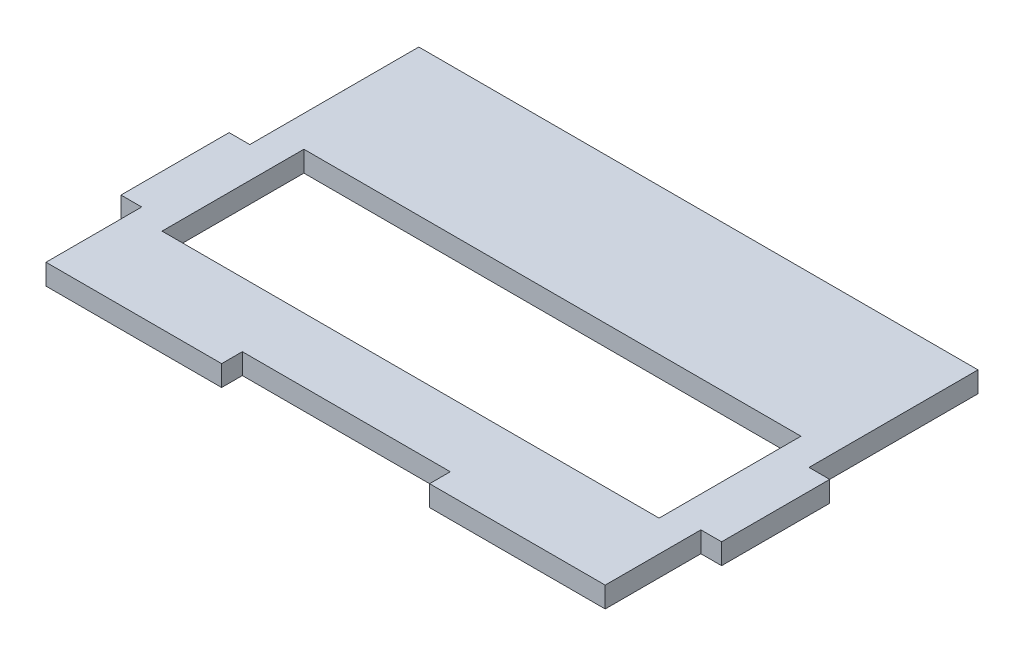
ISO-10303-21;
HEADER;
FILE_DESCRIPTION(('STEP AP214'),'2;1');
FILE_NAME('part.step','',(''),(''),'','','');
FILE_SCHEMA(('AUTOMOTIVE_DESIGN { 1 0 10303 214 1 1 1 1 }'));
ENDSEC;
DATA;
#1=APPLICATION_CONTEXT('core data for automotive mechanical design processes');
#2=APPLICATION_PROTOCOL_DEFINITION('international standard','automotive_design',2000,#1);
#3=PRODUCT_CONTEXT('',#1,'mechanical');
#4=PRODUCT('Part','Part','',(#3));
#5=PRODUCT_RELATED_PRODUCT_CATEGORY('part','',(#4));
#6=PRODUCT_DEFINITION_FORMATION('','',#4);
#7=PRODUCT_DEFINITION_CONTEXT('part definition',#1,'design');
#8=PRODUCT_DEFINITION('design','',#6,#7);
#9=PRODUCT_DEFINITION_SHAPE('','',#8);
#10=(LENGTH_UNIT() NAMED_UNIT(*) SI_UNIT(.MILLI.,.METRE.));
#11=(NAMED_UNIT(*) PLANE_ANGLE_UNIT() SI_UNIT($,.RADIAN.));
#12=(NAMED_UNIT(*) SI_UNIT($,.STERADIAN.) SOLID_ANGLE_UNIT());
#13=UNCERTAINTY_MEASURE_WITH_UNIT(LENGTH_MEASURE(1.E-05),#10,'distance_accuracy_value','');
#14=(GEOMETRIC_REPRESENTATION_CONTEXT(3) GLOBAL_UNCERTAINTY_ASSIGNED_CONTEXT((#13)) GLOBAL_UNIT_ASSIGNED_CONTEXT((#10,
#11,#12)) REPRESENTATION_CONTEXT('',''));
#15=CARTESIAN_POINT('',(0.,0.,0.));
#16=DIRECTION('',(0.,0.,1.));
#17=DIRECTION('',(1.,0.,0.));
#18=AXIS2_PLACEMENT_3D('',#15,#16,#17);
#19=CARTESIAN_POINT('',(-72.5,5.,45.));
#20=DIRECTION('',(0.,0.,-1.));
#21=DIRECTION('',(-1.,0.,0.));
#22=AXIS2_PLACEMENT_3D('',#19,#20,#21);
#23=PLANE('',#22);
#24=DIRECTION('',(0.,1.,0.));
#25=VECTOR('',#24,1.);
#26=CARTESIAN_POINT('',(25.1,0.,45.));
#27=LINE('',#26,#25);
#28=CARTESIAN_POINT('',(25.1,0.,45.));
#29=VERTEX_POINT('',#28);
#30=CARTESIAN_POINT('',(25.1,5.,45.));
#31=VERTEX_POINT('',#30);
#32=EDGE_CURVE('E210',#29,#31,#27,.T.);
#33=ORIENTED_EDGE('',*,*,#32,.F.);
#34=DIRECTION('',(1.,0.,0.));
#35=VECTOR('',#34,1.);
#36=CARTESIAN_POINT('',(-72.5,0.,45.));
#37=LINE('',#36,#35);
#38=CARTESIAN_POINT('',(67.5,0.,45.));
#39=VERTEX_POINT('',#38);
#40=EDGE_CURVE('E196',#29,#39,#37,.T.);
#41=ORIENTED_EDGE('',*,*,#40,.T.);
#42=DIRECTION('',(0.,1.,0.));
#43=VECTOR('',#42,1.);
#44=CARTESIAN_POINT('',(67.5,0.,45.));
#45=LINE('',#44,#43);
#46=CARTESIAN_POINT('',(67.5,5.,45.));
#47=VERTEX_POINT('',#46);
#48=EDGE_CURVE('E239',#39,#47,#45,.T.);
#49=ORIENTED_EDGE('',*,*,#48,.T.);
#50=DIRECTION('',(1.,0.,0.));
#51=VECTOR('',#50,1.);
#52=CARTESIAN_POINT('',(-72.5,5.,45.));
#53=LINE('',#52,#51);
#54=EDGE_CURVE('E48',#31,#47,#53,.T.);
#55=ORIENTED_EDGE('',*,*,#54,.F.);
#56=EDGE_LOOP('',(#33,#41,#49,#55));
#57=FACE_BOUND('',#56,.T.);
#58=ADVANCED_FACE('F39',(#57),#23,.F.);
#59=CARTESIAN_POINT('',(0.,5.,0.));
#60=DIRECTION('',(0.,-1.,0.));
#61=DIRECTION('',(0.,0.,-1.));
#62=AXIS2_PLACEMENT_3D('',#59,#60,#61);
#63=PLANE('',#62);
#64=DIRECTION('',(-1.,0.,0.));
#65=VECTOR('',#64,1.);
#66=CARTESIAN_POINT('',(-60.,5.,-9.76000000000001));
#67=LINE('',#66,#65);
#68=CARTESIAN_POINT('',(60.,5.,-9.76000000000001));
#69=VERTEX_POINT('',#68);
#70=CARTESIAN_POINT('',(-60.,5.,-9.76000000000001));
#71=VERTEX_POINT('',#70);
#72=EDGE_CURVE('E300',#69,#71,#67,.T.);
#73=ORIENTED_EDGE('',*,*,#72,.F.);
#74=DIRECTION('',(0.,0.,-1.));
#75=VECTOR('',#74,1.);
#76=CARTESIAN_POINT('',(60.,5.,24.49));
#77=LINE('',#76,#75);
#78=CARTESIAN_POINT('',(60.,5.,24.49));
#79=VERTEX_POINT('',#78);
#80=EDGE_CURVE('E278',#79,#69,#77,.T.);
#81=ORIENTED_EDGE('',*,*,#80,.F.);
#82=DIRECTION('',(1.,0.,0.));
#83=VECTOR('',#82,1.);
#84=CARTESIAN_POINT('',(-60.,5.,24.49));
#85=LINE('',#84,#83);
#86=CARTESIAN_POINT('',(-60.,5.,24.49));
#87=VERTEX_POINT('',#86);
#88=EDGE_CURVE('E290',#87,#79,#85,.T.);
#89=ORIENTED_EDGE('',*,*,#88,.F.);
#90=DIRECTION('',(0.,0.,1.));
#91=VECTOR('',#90,1.);
#92=CARTESIAN_POINT('',(-60.,5.,24.49));
#93=LINE('',#92,#91);
#94=EDGE_CURVE('E304',#71,#87,#93,.T.);
#95=ORIENTED_EDGE('',*,*,#94,.F.);
#96=EDGE_LOOP('',(#73,#81,#89,#95));
#97=FACE_BOUND('',#96,.T.);
#98=DIRECTION('',(0.,0.,-1.));
#99=VECTOR('',#98,1.);
#100=CARTESIAN_POINT('',(25.1,5.,40.));
#101=LINE('',#100,#99);
#102=CARTESIAN_POINT('',(25.1,5.,40.));
#103=VERTEX_POINT('',#102);
#104=EDGE_CURVE('E184',#31,#103,#101,.T.);
#105=ORIENTED_EDGE('',*,*,#104,.F.);
#106=ORIENTED_EDGE('',*,*,#54,.T.);
#107=DIRECTION('',(0.,0.,1.));
#108=VECTOR('',#107,1.);
#109=CARTESIAN_POINT('',(67.5,5.,45.));
#110=LINE('',#109,#108);
#111=CARTESIAN_POINT('',(67.5,5.,21.9));
#112=VERTEX_POINT('',#111);
#113=EDGE_CURVE('E242',#112,#47,#110,.T.);
#114=ORIENTED_EDGE('',*,*,#113,.F.);
#115=DIRECTION('',(-1.,0.,0.));
#116=VECTOR('',#115,1.);
#117=CARTESIAN_POINT('',(72.5,5.,21.9));
#118=LINE('',#117,#116);
#119=CARTESIAN_POINT('',(72.5,5.,21.9));
#120=VERTEX_POINT('',#119);
#121=EDGE_CURVE('E225',#120,#112,#118,.T.);
#122=ORIENTED_EDGE('',*,*,#121,.F.);
#123=DIRECTION('',(0.,0.,-1.));
#124=VECTOR('',#123,1.);
#125=CARTESIAN_POINT('',(72.5,5.,45.));
#126=LINE('',#125,#124);
#127=CARTESIAN_POINT('',(72.5,5.,-4.2));
#128=VERTEX_POINT('',#127);
#129=EDGE_CURVE('E316',#120,#128,#126,.T.);
#130=ORIENTED_EDGE('',*,*,#129,.T.);
#131=DIRECTION('',(1.,0.,0.));
#132=VECTOR('',#131,1.);
#133=CARTESIAN_POINT('',(72.5,5.,-4.2));
#134=LINE('',#133,#132);
#135=CARTESIAN_POINT('',(67.5,5.,-4.2));
#136=VERTEX_POINT('',#135);
#137=EDGE_CURVE('E256',#136,#128,#134,.T.);
#138=ORIENTED_EDGE('',*,*,#137,.F.);
#139=DIRECTION('',(0.,0.,1.));
#140=VECTOR('',#139,1.);
#141=CARTESIAN_POINT('',(67.5,5.,-45.));
#142=LINE('',#141,#140);
#143=CARTESIAN_POINT('',(67.5,5.,-45.));
#144=VERTEX_POINT('',#143);
#145=EDGE_CURVE('E244',#144,#136,#142,.T.);
#146=ORIENTED_EDGE('',*,*,#145,.F.);
#147=DIRECTION('',(-1.,0.,0.));
#148=VECTOR('',#147,1.);
#149=CARTESIAN_POINT('',(-72.5,5.,-45.));
#150=LINE('',#149,#148);
#151=CARTESIAN_POINT('',(-67.5,5.,-45.));
#152=VERTEX_POINT('',#151);
#153=EDGE_CURVE('E317',#144,#152,#150,.T.);
#154=ORIENTED_EDGE('',*,*,#153,.T.);
#155=DIRECTION('',(0.,0.,-1.));
#156=VECTOR('',#155,1.);
#157=CARTESIAN_POINT('',(-67.5,5.,-45.));
#158=LINE('',#157,#156);
#159=CARTESIAN_POINT('',(-67.5,5.,-4.2));
#160=VERTEX_POINT('',#159);
#161=EDGE_CURVE('E269',#160,#152,#158,.T.);
#162=ORIENTED_EDGE('',*,*,#161,.F.);
#163=DIRECTION('',(1.,0.,0.));
#164=VECTOR('',#163,1.);
#165=CARTESIAN_POINT('',(-72.5,5.,-4.2));
#166=LINE('',#165,#164);
#167=CARTESIAN_POINT('',(-72.5,5.,-4.2));
#168=VERTEX_POINT('',#167);
#169=EDGE_CURVE('E230',#168,#160,#166,.T.);
#170=ORIENTED_EDGE('',*,*,#169,.F.);
#171=DIRECTION('',(0.,0.,1.));
#172=VECTOR('',#171,1.);
#173=CARTESIAN_POINT('',(-72.5,5.,45.));
#174=LINE('',#173,#172);
#175=CARTESIAN_POINT('',(-72.5,5.,21.9));
#176=VERTEX_POINT('',#175);
#177=EDGE_CURVE('E325',#168,#176,#174,.T.);
#178=ORIENTED_EDGE('',*,*,#177,.T.);
#179=DIRECTION('',(-1.,0.,0.));
#180=VECTOR('',#179,1.);
#181=CARTESIAN_POINT('',(-72.5,5.,21.9));
#182=LINE('',#181,#180);
#183=CARTESIAN_POINT('',(-67.5,5.,21.9));
#184=VERTEX_POINT('',#183);
#185=EDGE_CURVE('E224',#184,#176,#182,.T.);
#186=ORIENTED_EDGE('',*,*,#185,.F.);
#187=DIRECTION('',(0.,0.,-1.));
#188=VECTOR('',#187,1.);
#189=CARTESIAN_POINT('',(-67.5,5.,45.));
#190=LINE('',#189,#188);
#191=CARTESIAN_POINT('',(-67.5,5.,45.));
#192=VERTEX_POINT('',#191);
#193=EDGE_CURVE('E223',#192,#184,#190,.T.);
#194=ORIENTED_EDGE('',*,*,#193,.F.);
#195=CARTESIAN_POINT('',(-25.1,5.,45.));
#196=VERTEX_POINT('',#195);
#197=EDGE_CURVE('E11',#192,#196,#53,.T.);
#198=ORIENTED_EDGE('',*,*,#197,.T.);
#199=DIRECTION('',(0.,0.,1.));
#200=VECTOR('',#199,1.);
#201=CARTESIAN_POINT('',(-25.1,5.,40.));
#202=LINE('',#201,#200);
#203=CARTESIAN_POINT('',(-25.1,5.,40.));
#204=VERTEX_POINT('',#203);
#205=EDGE_CURVE('E200',#204,#196,#202,.T.);
#206=ORIENTED_EDGE('',*,*,#205,.F.);
#207=DIRECTION('',(-1.,0.,0.));
#208=VECTOR('',#207,1.);
#209=CARTESIAN_POINT('',(-25.1,5.,40.));
#210=LINE('',#209,#208);
#211=EDGE_CURVE('E203',#103,#204,#210,.T.);
#212=ORIENTED_EDGE('',*,*,#211,.F.);
#213=EDGE_LOOP('',(#105,#106,#114,#122,#130,#138,#146,#154,#162,#170,#178,#186,#194,#198,#206,#212));
#214=FACE_BOUND('',#213,.T.);
#215=ADVANCED_FACE('F352',(#97,#214),#63,.F.);
#216=CARTESIAN_POINT('',(0.,0.,0.));
#217=DIRECTION('',(0.,-1.,0.));
#218=DIRECTION('',(0.,0.,-1.));
#219=AXIS2_PLACEMENT_3D('',#216,#217,#218);
#220=PLANE('',#219);
#221=DIRECTION('',(0.,0.,-1.));
#222=VECTOR('',#221,1.);
#223=CARTESIAN_POINT('',(60.,0.,24.49));
#224=LINE('',#223,#222);
#225=CARTESIAN_POINT('',(60.,0.,24.49));
#226=VERTEX_POINT('',#225);
#227=CARTESIAN_POINT('',(60.,0.,-9.76000000000001));
#228=VERTEX_POINT('',#227);
#229=EDGE_CURVE('E285',#226,#228,#224,.T.);
#230=ORIENTED_EDGE('',*,*,#229,.T.);
#231=DIRECTION('',(-1.,0.,0.));
#232=VECTOR('',#231,1.);
#233=CARTESIAN_POINT('',(-60.,0.,-9.76000000000001));
#234=LINE('',#233,#232);
#235=CARTESIAN_POINT('',(-60.,0.,-9.76000000000001));
#236=VERTEX_POINT('',#235);
#237=EDGE_CURVE('E289',#228,#236,#234,.T.);
#238=ORIENTED_EDGE('',*,*,#237,.T.);
#239=DIRECTION('',(0.,0.,1.));
#240=VECTOR('',#239,1.);
#241=CARTESIAN_POINT('',(-60.,0.,24.49));
#242=LINE('',#241,#240);
#243=CARTESIAN_POINT('',(-60.,0.,24.49));
#244=VERTEX_POINT('',#243);
#245=EDGE_CURVE('E292',#236,#244,#242,.T.);
#246=ORIENTED_EDGE('',*,*,#245,.T.);
#247=DIRECTION('',(1.,0.,0.));
#248=VECTOR('',#247,1.);
#249=CARTESIAN_POINT('',(-60.,0.,24.49));
#250=LINE('',#249,#248);
#251=EDGE_CURVE('E294',#244,#226,#250,.T.);
#252=ORIENTED_EDGE('',*,*,#251,.T.);
#253=EDGE_LOOP('',(#230,#238,#246,#252));
#254=FACE_BOUND('',#253,.T.);
#255=ORIENTED_EDGE('',*,*,#40,.F.);
#256=DIRECTION('',(0.,0.,-1.));
#257=VECTOR('',#256,1.);
#258=CARTESIAN_POINT('',(25.1,0.,40.));
#259=LINE('',#258,#257);
#260=CARTESIAN_POINT('',(25.1,0.,40.));
#261=VERTEX_POINT('',#260);
#262=EDGE_CURVE('E182',#29,#261,#259,.T.);
#263=ORIENTED_EDGE('',*,*,#262,.T.);
#264=DIRECTION('',(-1.,0.,0.));
#265=VECTOR('',#264,1.);
#266=CARTESIAN_POINT('',(-25.1,0.,40.));
#267=LINE('',#266,#265);
#268=CARTESIAN_POINT('',(-25.1,0.,40.));
#269=VERTEX_POINT('',#268);
#270=EDGE_CURVE('E192',#261,#269,#267,.T.);
#271=ORIENTED_EDGE('',*,*,#270,.T.);
#272=DIRECTION('',(0.,0.,1.));
#273=VECTOR('',#272,1.);
#274=CARTESIAN_POINT('',(-25.1,0.,40.));
#275=LINE('',#274,#273);
#276=CARTESIAN_POINT('',(-25.1,0.,45.));
#277=VERTEX_POINT('',#276);
#278=EDGE_CURVE('E57',#269,#277,#275,.T.);
#279=ORIENTED_EDGE('',*,*,#278,.T.);
#280=CARTESIAN_POINT('',(-67.5,0.,45.));
#281=VERTEX_POINT('',#280);
#282=EDGE_CURVE('E43',#281,#277,#37,.T.);
#283=ORIENTED_EDGE('',*,*,#282,.F.);
#284=DIRECTION('',(0.,0.,-1.));
#285=VECTOR('',#284,1.);
#286=CARTESIAN_POINT('',(-67.5,0.,45.));
#287=LINE('',#286,#285);
#288=CARTESIAN_POINT('',(-67.5,0.,21.9));
#289=VERTEX_POINT('',#288);
#290=EDGE_CURVE('E228',#281,#289,#287,.T.);
#291=ORIENTED_EDGE('',*,*,#290,.T.);
#292=DIRECTION('',(-1.,0.,0.));
#293=VECTOR('',#292,1.);
#294=CARTESIAN_POINT('',(-72.5,0.,21.9));
#295=LINE('',#294,#293);
#296=CARTESIAN_POINT('',(-72.5,0.,21.9));
#297=VERTEX_POINT('',#296);
#298=EDGE_CURVE('E216',#289,#297,#295,.T.);
#299=ORIENTED_EDGE('',*,*,#298,.T.);
#300=DIRECTION('',(0.,0.,1.));
#301=VECTOR('',#300,1.);
#302=CARTESIAN_POINT('',(-72.5,0.,45.));
#303=LINE('',#302,#301);
#304=CARTESIAN_POINT('',(-72.5,0.,-4.2));
#305=VERTEX_POINT('',#304);
#306=EDGE_CURVE('E328',#305,#297,#303,.T.);
#307=ORIENTED_EDGE('',*,*,#306,.F.);
#308=DIRECTION('',(1.,0.,0.));
#309=VECTOR('',#308,1.);
#310=CARTESIAN_POINT('',(-72.5,0.,-4.2));
#311=LINE('',#310,#309);
#312=CARTESIAN_POINT('',(-67.5,0.,-4.2));
#313=VERTEX_POINT('',#312);
#314=EDGE_CURVE('E266',#305,#313,#311,.T.);
#315=ORIENTED_EDGE('',*,*,#314,.T.);
#316=DIRECTION('',(0.,0.,-1.));
#317=VECTOR('',#316,1.);
#318=CARTESIAN_POINT('',(-67.5,0.,-45.));
#319=LINE('',#318,#317);
#320=CARTESIAN_POINT('',(-67.5,0.,-45.));
#321=VERTEX_POINT('',#320);
#322=EDGE_CURVE('E267',#313,#321,#319,.T.);
#323=ORIENTED_EDGE('',*,*,#322,.T.);
#324=DIRECTION('',(-1.,0.,0.));
#325=VECTOR('',#324,1.);
#326=CARTESIAN_POINT('',(-72.5,0.,-45.));
#327=LINE('',#326,#325);
#328=CARTESIAN_POINT('',(67.5,0.,-45.));
#329=VERTEX_POINT('',#328);
#330=EDGE_CURVE('E330',#329,#321,#327,.T.);
#331=ORIENTED_EDGE('',*,*,#330,.F.);
#332=DIRECTION('',(0.,0.,1.));
#333=VECTOR('',#332,1.);
#334=CARTESIAN_POINT('',(67.5,0.,-45.));
#335=LINE('',#334,#333);
#336=CARTESIAN_POINT('',(67.5,0.,-4.2));
#337=VERTEX_POINT('',#336);
#338=EDGE_CURVE('E257',#329,#337,#335,.T.);
#339=ORIENTED_EDGE('',*,*,#338,.T.);
#340=DIRECTION('',(1.,0.,0.));
#341=VECTOR('',#340,1.);
#342=CARTESIAN_POINT('',(72.5,0.,-4.2));
#343=LINE('',#342,#341);
#344=CARTESIAN_POINT('',(72.5,0.,-4.2));
#345=VERTEX_POINT('',#344);
#346=EDGE_CURVE('E65',#337,#345,#343,.T.);
#347=ORIENTED_EDGE('',*,*,#346,.T.);
#348=DIRECTION('',(0.,0.,-1.));
#349=VECTOR('',#348,1.);
#350=CARTESIAN_POINT('',(72.5,0.,45.));
#351=LINE('',#350,#349);
#352=CARTESIAN_POINT('',(72.5,0.,21.9));
#353=VERTEX_POINT('',#352);
#354=EDGE_CURVE('E310',#353,#345,#351,.T.);
#355=ORIENTED_EDGE('',*,*,#354,.F.);
#356=DIRECTION('',(-1.,0.,0.));
#357=VECTOR('',#356,1.);
#358=CARTESIAN_POINT('',(72.5,0.,21.9));
#359=LINE('',#358,#357);
#360=CARTESIAN_POINT('',(67.5,0.,21.9));
#361=VERTEX_POINT('',#360);
#362=EDGE_CURVE('E247',#353,#361,#359,.T.);
#363=ORIENTED_EDGE('',*,*,#362,.T.);
#364=DIRECTION('',(0.,0.,1.));
#365=VECTOR('',#364,1.);
#366=CARTESIAN_POINT('',(67.5,0.,45.));
#367=LINE('',#366,#365);
#368=EDGE_CURVE('E237',#361,#39,#367,.T.);
#369=ORIENTED_EDGE('',*,*,#368,.T.);
#370=EDGE_LOOP('',(#255,#263,#271,#279,#283,#291,#299,#307,#315,#323,#331,#339,#347,#355,#363,#369));
#371=FACE_BOUND('',#370,.T.);
#372=ADVANCED_FACE('F198',(#254,#371),#220,.T.);
#373=CARTESIAN_POINT('',(72.5,5.,45.));
#374=DIRECTION('',(-1.,0.,0.));
#375=DIRECTION('',(0.,0.,1.));
#376=AXIS2_PLACEMENT_3D('',#373,#374,#375);
#377=PLANE('',#376);
#378=ORIENTED_EDGE('',*,*,#354,.T.);
#379=DIRECTION('',(0.,1.,0.));
#380=VECTOR('',#379,1.);
#381=CARTESIAN_POINT('',(72.5,0.,-4.2));
#382=LINE('',#381,#380);
#383=EDGE_CURVE('E207',#345,#128,#382,.T.);
#384=ORIENTED_EDGE('',*,*,#383,.T.);
#385=ORIENTED_EDGE('',*,*,#129,.F.);
#386=DIRECTION('',(0.,1.,0.));
#387=VECTOR('',#386,1.);
#388=CARTESIAN_POINT('',(72.5,0.,21.9));
#389=LINE('',#388,#387);
#390=EDGE_CURVE('E231',#353,#120,#389,.T.);
#391=ORIENTED_EDGE('',*,*,#390,.F.);
#392=EDGE_LOOP('',(#378,#384,#385,#391));
#393=FACE_BOUND('',#392,.T.);
#394=ADVANCED_FACE('F41',(#393),#377,.F.);
#395=CARTESIAN_POINT('',(-72.5,5.,-45.));
#396=DIRECTION('',(0.,0.,1.));
#397=DIRECTION('',(1.,0.,0.));
#398=AXIS2_PLACEMENT_3D('',#395,#396,#397);
#399=PLANE('',#398);
#400=DIRECTION('',(0.,1.,0.));
#401=VECTOR('',#400,1.);
#402=CARTESIAN_POINT('',(67.5,0.,-45.));
#403=LINE('',#402,#401);
#404=EDGE_CURVE('E252',#329,#144,#403,.T.);
#405=ORIENTED_EDGE('',*,*,#404,.F.);
#406=ORIENTED_EDGE('',*,*,#330,.T.);
#407=DIRECTION('',(0.,1.,0.));
#408=VECTOR('',#407,1.);
#409=CARTESIAN_POINT('',(-67.5,0.,-45.));
#410=LINE('',#409,#408);
#411=EDGE_CURVE('E280',#321,#152,#410,.T.);
#412=ORIENTED_EDGE('',*,*,#411,.T.);
#413=ORIENTED_EDGE('',*,*,#153,.F.);
#414=EDGE_LOOP('',(#405,#406,#412,#413));
#415=FACE_BOUND('',#414,.T.);
#416=ADVANCED_FACE('F362',(#415),#399,.F.);
#417=CARTESIAN_POINT('',(-72.5,5.,45.));
#418=DIRECTION('',(1.,0.,0.));
#419=DIRECTION('',(0.,0.,-1.));
#420=AXIS2_PLACEMENT_3D('',#417,#418,#419);
#421=PLANE('',#420);
#422=ORIENTED_EDGE('',*,*,#306,.T.);
#423=DIRECTION('',(0.,1.,0.));
#424=VECTOR('',#423,1.);
#425=CARTESIAN_POINT('',(-72.5,0.,21.9));
#426=LINE('',#425,#424);
#427=EDGE_CURVE('E218',#297,#176,#426,.T.);
#428=ORIENTED_EDGE('',*,*,#427,.T.);
#429=ORIENTED_EDGE('',*,*,#177,.F.);
#430=DIRECTION('',(0.,1.,0.));
#431=VECTOR('',#430,1.);
#432=CARTESIAN_POINT('',(-72.5,0.,-4.2));
#433=LINE('',#432,#431);
#434=EDGE_CURVE('E272',#305,#168,#433,.T.);
#435=ORIENTED_EDGE('',*,*,#434,.F.);
#436=EDGE_LOOP('',(#422,#428,#429,#435));
#437=FACE_BOUND('',#436,.T.);
#438=ADVANCED_FACE('F348',(#437),#421,.F.);
#439=ORIENTED_EDGE('',*,*,#282,.T.);
#440=DIRECTION('',(0.,1.,0.));
#441=VECTOR('',#440,1.);
#442=CARTESIAN_POINT('',(-25.1,0.,45.));
#443=LINE('',#442,#441);
#444=EDGE_CURVE('E209',#277,#196,#443,.T.);
#445=ORIENTED_EDGE('',*,*,#444,.T.);
#446=ORIENTED_EDGE('',*,*,#197,.F.);
#447=DIRECTION('',(0.,1.,0.));
#448=VECTOR('',#447,1.);
#449=CARTESIAN_POINT('',(-67.5,0.,45.));
#450=LINE('',#449,#448);
#451=EDGE_CURVE('E212',#281,#192,#450,.T.);
#452=ORIENTED_EDGE('',*,*,#451,.F.);
#453=EDGE_LOOP('',(#439,#445,#446,#452));
#454=FACE_BOUND('',#453,.T.);
#455=ADVANCED_FACE('F336',(#454),#23,.F.);
#456=CARTESIAN_POINT('',(60.,0.,24.49));
#457=DIRECTION('',(1.,0.,0.));
#458=DIRECTION('',(0.,0.,-1.));
#459=AXIS2_PLACEMENT_3D('',#456,#457,#458);
#460=PLANE('',#459);
#461=ORIENTED_EDGE('',*,*,#80,.T.);
#462=DIRECTION('',(0.,1.,0.));
#463=VECTOR('',#462,1.);
#464=CARTESIAN_POINT('',(60.,0.,-9.76000000000001));
#465=LINE('',#464,#463);
#466=EDGE_CURVE('E299',#228,#69,#465,.T.);
#467=ORIENTED_EDGE('',*,*,#466,.F.);
#468=ORIENTED_EDGE('',*,*,#229,.F.);
#469=DIRECTION('',(0.,1.,0.));
#470=VECTOR('',#469,1.);
#471=CARTESIAN_POINT('',(60.,0.,24.49));
#472=LINE('',#471,#470);
#473=EDGE_CURVE('E307',#226,#79,#472,.T.);
#474=ORIENTED_EDGE('',*,*,#473,.T.);
#475=EDGE_LOOP('',(#461,#467,#468,#474));
#476=FACE_BOUND('',#475,.T.);
#477=ADVANCED_FACE('F405',(#476),#460,.F.);
#478=CARTESIAN_POINT('',(-60.,0.,24.49));
#479=DIRECTION('',(0.,0.,1.));
#480=DIRECTION('',(1.,0.,0.));
#481=AXIS2_PLACEMENT_3D('',#478,#479,#480);
#482=PLANE('',#481);
#483=ORIENTED_EDGE('',*,*,#88,.T.);
#484=ORIENTED_EDGE('',*,*,#473,.F.);
#485=ORIENTED_EDGE('',*,*,#251,.F.);
#486=DIRECTION('',(0.,1.,0.));
#487=VECTOR('',#486,1.);
#488=CARTESIAN_POINT('',(-60.,0.,24.49));
#489=LINE('',#488,#487);
#490=EDGE_CURVE('E309',#244,#87,#489,.T.);
#491=ORIENTED_EDGE('',*,*,#490,.T.);
#492=EDGE_LOOP('',(#483,#484,#485,#491));
#493=FACE_BOUND('',#492,.T.);
#494=ADVANCED_FACE('F409',(#493),#482,.F.);
#495=CARTESIAN_POINT('',(-60.,0.,24.49));
#496=DIRECTION('',(-1.,0.,0.));
#497=DIRECTION('',(0.,0.,1.));
#498=AXIS2_PLACEMENT_3D('',#495,#496,#497);
#499=PLANE('',#498);
#500=ORIENTED_EDGE('',*,*,#94,.T.);
#501=ORIENTED_EDGE('',*,*,#490,.F.);
#502=ORIENTED_EDGE('',*,*,#245,.F.);
#503=DIRECTION('',(0.,1.,0.));
#504=VECTOR('',#503,1.);
#505=CARTESIAN_POINT('',(-60.,0.,-9.76000000000001));
#506=LINE('',#505,#504);
#507=EDGE_CURVE('E315',#236,#71,#506,.T.);
#508=ORIENTED_EDGE('',*,*,#507,.T.);
#509=EDGE_LOOP('',(#500,#501,#502,#508));
#510=FACE_BOUND('',#509,.T.);
#511=ADVANCED_FACE('F428',(#510),#499,.F.);
#512=CARTESIAN_POINT('',(-60.,0.,-9.76000000000001));
#513=DIRECTION('',(0.,0.,-1.));
#514=DIRECTION('',(-1.,0.,0.));
#515=AXIS2_PLACEMENT_3D('',#512,#513,#514);
#516=PLANE('',#515);
#517=ORIENTED_EDGE('',*,*,#72,.T.);
#518=ORIENTED_EDGE('',*,*,#507,.F.);
#519=ORIENTED_EDGE('',*,*,#237,.F.);
#520=ORIENTED_EDGE('',*,*,#466,.T.);
#521=EDGE_LOOP('',(#517,#518,#519,#520));
#522=FACE_BOUND('',#521,.T.);
#523=ADVANCED_FACE('F422',(#522),#516,.F.);
#524=CARTESIAN_POINT('',(-67.5,0.,-45.));
#525=DIRECTION('',(1.,0.,0.));
#526=DIRECTION('',(0.,0.,-1.));
#527=AXIS2_PLACEMENT_3D('',#524,#525,#526);
#528=PLANE('',#527);
#529=ORIENTED_EDGE('',*,*,#161,.T.);
#530=ORIENTED_EDGE('',*,*,#411,.F.);
#531=ORIENTED_EDGE('',*,*,#322,.F.);
#532=DIRECTION('',(0.,1.,0.));
#533=VECTOR('',#532,1.);
#534=CARTESIAN_POINT('',(-67.5,0.,-4.2));
#535=LINE('',#534,#533);
#536=EDGE_CURVE('E283',#313,#160,#535,.T.);
#537=ORIENTED_EDGE('',*,*,#536,.T.);
#538=EDGE_LOOP('',(#529,#530,#531,#537));
#539=FACE_BOUND('',#538,.T.);
#540=ADVANCED_FACE('F430',(#539),#528,.F.);
#541=CARTESIAN_POINT('',(-72.5,0.,-4.2));
#542=DIRECTION('',(0.,0.,1.));
#543=DIRECTION('',(1.,0.,0.));
#544=AXIS2_PLACEMENT_3D('',#541,#542,#543);
#545=PLANE('',#544);
#546=ORIENTED_EDGE('',*,*,#169,.T.);
#547=ORIENTED_EDGE('',*,*,#536,.F.);
#548=ORIENTED_EDGE('',*,*,#314,.F.);
#549=ORIENTED_EDGE('',*,*,#434,.T.);
#550=EDGE_LOOP('',(#546,#547,#548,#549));
#551=FACE_BOUND('',#550,.T.);
#552=ADVANCED_FACE('F359',(#551),#545,.F.);
#553=CARTESIAN_POINT('',(-72.5,0.,21.9));
#554=DIRECTION('',(0.,0.,-1.));
#555=DIRECTION('',(-1.,0.,0.));
#556=AXIS2_PLACEMENT_3D('',#553,#554,#555);
#557=PLANE('',#556);
#558=ORIENTED_EDGE('',*,*,#185,.T.);
#559=ORIENTED_EDGE('',*,*,#427,.F.);
#560=ORIENTED_EDGE('',*,*,#298,.F.);
#561=DIRECTION('',(0.,1.,0.));
#562=VECTOR('',#561,1.);
#563=CARTESIAN_POINT('',(-67.5,0.,21.9));
#564=LINE('',#563,#562);
#565=EDGE_CURVE('E220',#289,#184,#564,.T.);
#566=ORIENTED_EDGE('',*,*,#565,.T.);
#567=EDGE_LOOP('',(#558,#559,#560,#566));
#568=FACE_BOUND('',#567,.T.);
#569=ADVANCED_FACE('F346',(#568),#557,.F.);
#570=CARTESIAN_POINT('',(-67.5,0.,45.));
#571=DIRECTION('',(1.,0.,0.));
#572=DIRECTION('',(0.,0.,-1.));
#573=AXIS2_PLACEMENT_3D('',#570,#571,#572);
#574=PLANE('',#573);
#575=ORIENTED_EDGE('',*,*,#193,.T.);
#576=ORIENTED_EDGE('',*,*,#565,.F.);
#577=ORIENTED_EDGE('',*,*,#290,.F.);
#578=ORIENTED_EDGE('',*,*,#451,.T.);
#579=EDGE_LOOP('',(#575,#576,#577,#578));
#580=FACE_BOUND('',#579,.T.);
#581=ADVANCED_FACE('F341',(#580),#574,.F.);
#582=CARTESIAN_POINT('',(67.5,0.,45.));
#583=DIRECTION('',(-1.,0.,0.));
#584=DIRECTION('',(0.,0.,1.));
#585=AXIS2_PLACEMENT_3D('',#582,#583,#584);
#586=PLANE('',#585);
#587=ORIENTED_EDGE('',*,*,#113,.T.);
#588=ORIENTED_EDGE('',*,*,#48,.F.);
#589=ORIENTED_EDGE('',*,*,#368,.F.);
#590=DIRECTION('',(0.,1.,0.));
#591=VECTOR('',#590,1.);
#592=CARTESIAN_POINT('',(67.5,0.,21.9));
#593=LINE('',#592,#591);
#594=EDGE_CURVE('E240',#361,#112,#593,.T.);
#595=ORIENTED_EDGE('',*,*,#594,.T.);
#596=EDGE_LOOP('',(#587,#588,#589,#595));
#597=FACE_BOUND('',#596,.T.);
#598=ADVANCED_FACE('F377',(#597),#586,.F.);
#599=CARTESIAN_POINT('',(72.5,0.,21.9));
#600=DIRECTION('',(0.,0.,-1.));
#601=DIRECTION('',(-1.,0.,0.));
#602=AXIS2_PLACEMENT_3D('',#599,#600,#601);
#603=PLANE('',#602);
#604=ORIENTED_EDGE('',*,*,#121,.T.);
#605=ORIENTED_EDGE('',*,*,#594,.F.);
#606=ORIENTED_EDGE('',*,*,#362,.F.);
#607=ORIENTED_EDGE('',*,*,#390,.T.);
#608=EDGE_LOOP('',(#604,#605,#606,#607));
#609=FACE_BOUND('',#608,.T.);
#610=ADVANCED_FACE('F376',(#609),#603,.F.);
#611=CARTESIAN_POINT('',(72.5,0.,-4.2));
#612=DIRECTION('',(0.,0.,1.));
#613=DIRECTION('',(1.,0.,0.));
#614=AXIS2_PLACEMENT_3D('',#611,#612,#613);
#615=PLANE('',#614);
#616=ORIENTED_EDGE('',*,*,#137,.T.);
#617=ORIENTED_EDGE('',*,*,#383,.F.);
#618=ORIENTED_EDGE('',*,*,#346,.F.);
#619=DIRECTION('',(0.,1.,0.));
#620=VECTOR('',#619,1.);
#621=CARTESIAN_POINT('',(67.5,0.,-4.2));
#622=LINE('',#621,#620);
#623=EDGE_CURVE('E255',#337,#136,#622,.T.);
#624=ORIENTED_EDGE('',*,*,#623,.T.);
#625=EDGE_LOOP('',(#616,#617,#618,#624));
#626=FACE_BOUND('',#625,.T.);
#627=ADVANCED_FACE('F367',(#626),#615,.F.);
#628=CARTESIAN_POINT('',(67.5,0.,-45.));
#629=DIRECTION('',(-1.,0.,0.));
#630=DIRECTION('',(0.,0.,1.));
#631=AXIS2_PLACEMENT_3D('',#628,#629,#630);
#632=PLANE('',#631);
#633=ORIENTED_EDGE('',*,*,#145,.T.);
#634=ORIENTED_EDGE('',*,*,#623,.F.);
#635=ORIENTED_EDGE('',*,*,#338,.F.);
#636=ORIENTED_EDGE('',*,*,#404,.T.);
#637=EDGE_LOOP('',(#633,#634,#635,#636));
#638=FACE_BOUND('',#637,.T.);
#639=ADVANCED_FACE('F368',(#638),#632,.F.);
#640=CARTESIAN_POINT('',(25.1,0.,40.));
#641=DIRECTION('',(1.,0.,0.));
#642=DIRECTION('',(0.,0.,-1.));
#643=AXIS2_PLACEMENT_3D('',#640,#641,#642);
#644=PLANE('',#643);
#645=ORIENTED_EDGE('',*,*,#104,.T.);
#646=DIRECTION('',(0.,1.,0.));
#647=VECTOR('',#646,1.);
#648=CARTESIAN_POINT('',(25.1,0.,40.));
#649=LINE('',#648,#647);
#650=EDGE_CURVE('E179',#261,#103,#649,.T.);
#651=ORIENTED_EDGE('',*,*,#650,.F.);
#652=ORIENTED_EDGE('',*,*,#262,.F.);
#653=ORIENTED_EDGE('',*,*,#32,.T.);
#654=EDGE_LOOP('',(#645,#651,#652,#653));
#655=FACE_BOUND('',#654,.T.);
#656=ADVANCED_FACE('F176',(#655),#644,.F.);
#657=CARTESIAN_POINT('',(-25.1,0.,40.));
#658=DIRECTION('',(-1.,0.,0.));
#659=DIRECTION('',(0.,0.,1.));
#660=AXIS2_PLACEMENT_3D('',#657,#658,#659);
#661=PLANE('',#660);
#662=ORIENTED_EDGE('',*,*,#205,.T.);
#663=ORIENTED_EDGE('',*,*,#444,.F.);
#664=ORIENTED_EDGE('',*,*,#278,.F.);
#665=DIRECTION('',(0.,1.,0.));
#666=VECTOR('',#665,1.);
#667=CARTESIAN_POINT('',(-25.1,0.,40.));
#668=LINE('',#667,#666);
#669=EDGE_CURVE('E187',#269,#204,#668,.T.);
#670=ORIENTED_EDGE('',*,*,#669,.T.);
#671=EDGE_LOOP('',(#662,#663,#664,#670));
#672=FACE_BOUND('',#671,.T.);
#673=ADVANCED_FACE('F385',(#672),#661,.F.);
#674=CARTESIAN_POINT('',(-25.1,0.,40.));
#675=DIRECTION('',(0.,0.,-1.));
#676=DIRECTION('',(-1.,0.,0.));
#677=AXIS2_PLACEMENT_3D('',#674,#675,#676);
#678=PLANE('',#677);
#679=ORIENTED_EDGE('',*,*,#211,.T.);
#680=ORIENTED_EDGE('',*,*,#669,.F.);
#681=ORIENTED_EDGE('',*,*,#270,.F.);
#682=ORIENTED_EDGE('',*,*,#650,.T.);
#683=EDGE_LOOP('',(#679,#680,#681,#682));
#684=FACE_BOUND('',#683,.T.);
#685=ADVANCED_FACE('F194',(#684),#678,.F.);
#686=CLOSED_SHELL('',(#58,#215,#372,#394,#416,#438,#455,#477,#494,#511,#523,#540,#552,#569,#581,
#598,#610,#627,#639,#656,#673,#685));
#687=MANIFOLD_SOLID_BREP('B2',#686);
#688=ADVANCED_BREP_SHAPE_REPRESENTATION('',(#18,#687),#14);
#689=SHAPE_DEFINITION_REPRESENTATION(#9,#688);
ENDSEC;
END-ISO-10303-21;
